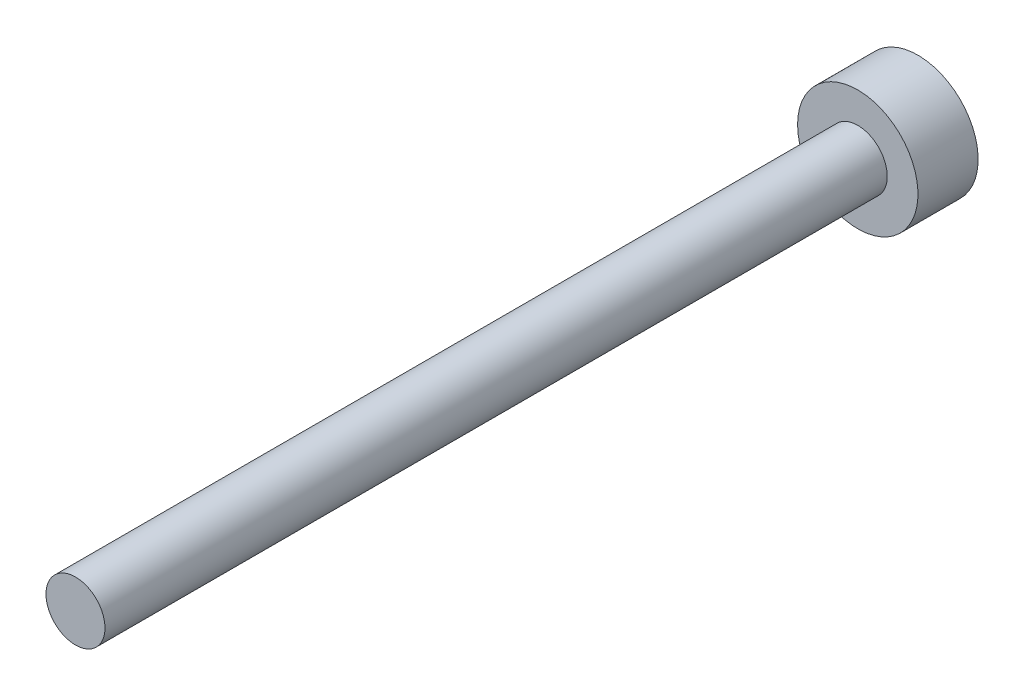
ISO-10303-21;
HEADER;
FILE_DESCRIPTION(('STEP AP214'),'2;1');
FILE_NAME('part.step','',(''),(''),'','','');
FILE_SCHEMA(('AUTOMOTIVE_DESIGN { 1 0 10303 214 1 1 1 1 }'));
ENDSEC;
DATA;
#1=APPLICATION_CONTEXT('core data for automotive mechanical design processes');
#2=APPLICATION_PROTOCOL_DEFINITION('international standard','automotive_design',2000,#1);
#3=PRODUCT_CONTEXT('',#1,'mechanical');
#4=PRODUCT('Part','Part','',(#3));
#5=PRODUCT_RELATED_PRODUCT_CATEGORY('part','',(#4));
#6=PRODUCT_DEFINITION_FORMATION('','',#4);
#7=PRODUCT_DEFINITION_CONTEXT('part definition',#1,'design');
#8=PRODUCT_DEFINITION('design','',#6,#7);
#9=PRODUCT_DEFINITION_SHAPE('','',#8);
#10=(LENGTH_UNIT() NAMED_UNIT(*) SI_UNIT(.MILLI.,.METRE.));
#11=(NAMED_UNIT(*) PLANE_ANGLE_UNIT() SI_UNIT($,.RADIAN.));
#12=(NAMED_UNIT(*) SI_UNIT($,.STERADIAN.) SOLID_ANGLE_UNIT());
#13=UNCERTAINTY_MEASURE_WITH_UNIT(LENGTH_MEASURE(1.E-05),#10,'distance_accuracy_value','');
#14=(GEOMETRIC_REPRESENTATION_CONTEXT(3) GLOBAL_UNCERTAINTY_ASSIGNED_CONTEXT((#13)) GLOBAL_UNIT_ASSIGNED_CONTEXT((#10,
#11,#12)) REPRESENTATION_CONTEXT('',''));
#15=CARTESIAN_POINT('',(0.,0.,0.));
#16=DIRECTION('',(0.,0.,1.));
#17=DIRECTION('',(1.,0.,0.));
#18=AXIS2_PLACEMENT_3D('',#15,#16,#17);
#19=CARTESIAN_POINT('',(0.,0.,70.));
#20=DIRECTION('',(0.,0.,-1.));
#21=DIRECTION('',(-1.,0.,0.));
#22=AXIS2_PLACEMENT_3D('',#19,#20,#21);
#23=CYLINDRICAL_SURFACE('',#22,2.45);
#24=CARTESIAN_POINT('',(0.,0.,70.));
#25=DIRECTION('',(0.,0.,1.));
#26=DIRECTION('',(1.,0.,0.));
#27=AXIS2_PLACEMENT_3D('',#24,#25,#26);
#28=CIRCLE('',#27,2.45);
#29=CARTESIAN_POINT('',(2.45,0.,70.));
#30=VERTEX_POINT('',#29);
#31=EDGE_CURVE('E44',#30,#30,#28,.T.);
#32=ORIENTED_EDGE('',*,*,#31,.F.);
#33=EDGE_LOOP('',(#32));
#34=FACE_BOUND('',#33,.T.);
#35=CARTESIAN_POINT('',(0.,0.,5.));
#36=DIRECTION('',(0.,0.,-1.));
#37=DIRECTION('',(-1.,0.,0.));
#38=AXIS2_PLACEMENT_3D('',#35,#36,#37);
#39=CIRCLE('',#38,2.45);
#40=CARTESIAN_POINT('',(-2.45,0.,5.));
#41=VERTEX_POINT('',#40);
#42=EDGE_CURVE('E10',#41,#41,#39,.T.);
#43=ORIENTED_EDGE('',*,*,#42,.F.);
#44=EDGE_LOOP('',(#43));
#45=FACE_BOUND('',#44,.T.);
#46=ADVANCED_FACE('F38',(#34,#45),#23,.T.);
#47=CARTESIAN_POINT('',(0.,0.,70.));
#48=DIRECTION('',(0.,0.,1.));
#49=DIRECTION('',(1.,0.,0.));
#50=AXIS2_PLACEMENT_3D('',#47,#48,#49);
#51=PLANE('',#50);
#52=ORIENTED_EDGE('',*,*,#31,.T.);
#53=EDGE_LOOP('',(#52));
#54=FACE_BOUND('',#53,.T.);
#55=ADVANCED_FACE('F63',(#54),#51,.T.);
#56=CARTESIAN_POINT('',(0.,0.,5.));
#57=DIRECTION('',(0.,0.,-1.));
#58=DIRECTION('',(-1.,0.,0.));
#59=AXIS2_PLACEMENT_3D('',#56,#57,#58);
#60=CYLINDRICAL_SURFACE('',#59,5.);
#61=CARTESIAN_POINT('',(0.,0.,5.));
#62=DIRECTION('',(0.,0.,-1.));
#63=DIRECTION('',(-1.,0.,0.));
#64=AXIS2_PLACEMENT_3D('',#61,#62,#63);
#65=CIRCLE('',#64,5.);
#66=CARTESIAN_POINT('',(-5.,0.,5.));
#67=VERTEX_POINT('',#66);
#68=EDGE_CURVE('E48',#67,#67,#65,.T.);
#69=ORIENTED_EDGE('',*,*,#68,.T.);
#70=EDGE_LOOP('',(#69));
#71=FACE_BOUND('',#70,.T.);
#72=CARTESIAN_POINT('',(0.,0.,0.));
#73=DIRECTION('',(0.,0.,-1.));
#74=DIRECTION('',(-1.,0.,0.));
#75=AXIS2_PLACEMENT_3D('',#72,#73,#74);
#76=CIRCLE('',#75,5.);
#77=CARTESIAN_POINT('',(-5.,0.,0.));
#78=VERTEX_POINT('',#77);
#79=EDGE_CURVE('E52',#78,#78,#76,.T.);
#80=ORIENTED_EDGE('',*,*,#79,.F.);
#81=EDGE_LOOP('',(#80));
#82=FACE_BOUND('',#81,.T.);
#83=ADVANCED_FACE('F60',(#71,#82),#60,.T.);
#84=CARTESIAN_POINT('',(0.,0.,5.));
#85=DIRECTION('',(0.,0.,-1.));
#86=DIRECTION('',(-1.,0.,0.));
#87=AXIS2_PLACEMENT_3D('',#84,#85,#86);
#88=PLANE('',#87);
#89=ORIENTED_EDGE('',*,*,#42,.T.);
#90=EDGE_LOOP('',(#89));
#91=FACE_BOUND('',#90,.T.);
#92=ORIENTED_EDGE('',*,*,#68,.F.);
#93=EDGE_LOOP('',(#92));
#94=FACE_BOUND('',#93,.T.);
#95=ADVANCED_FACE('F62',(#91,#94),#88,.F.);
#96=CARTESIAN_POINT('',(0.,0.,0.));
#97=DIRECTION('',(0.,0.,1.));
#98=DIRECTION('',(1.,0.,0.));
#99=AXIS2_PLACEMENT_3D('',#96,#97,#98);
#100=PLANE('',#99);
#101=ORIENTED_EDGE('',*,*,#79,.T.);
#102=EDGE_LOOP('',(#101));
#103=FACE_BOUND('',#102,.T.);
#104=ADVANCED_FACE('F58',(#103),#100,.F.);
#105=CLOSED_SHELL('',(#46,#55,#83,#95,#104));
#106=MANIFOLD_SOLID_BREP('B2',#105);
#107=ADVANCED_BREP_SHAPE_REPRESENTATION('',(#18,#106),#14);
#108=SHAPE_DEFINITION_REPRESENTATION(#9,#107);
ENDSEC;
END-ISO-10303-21;
